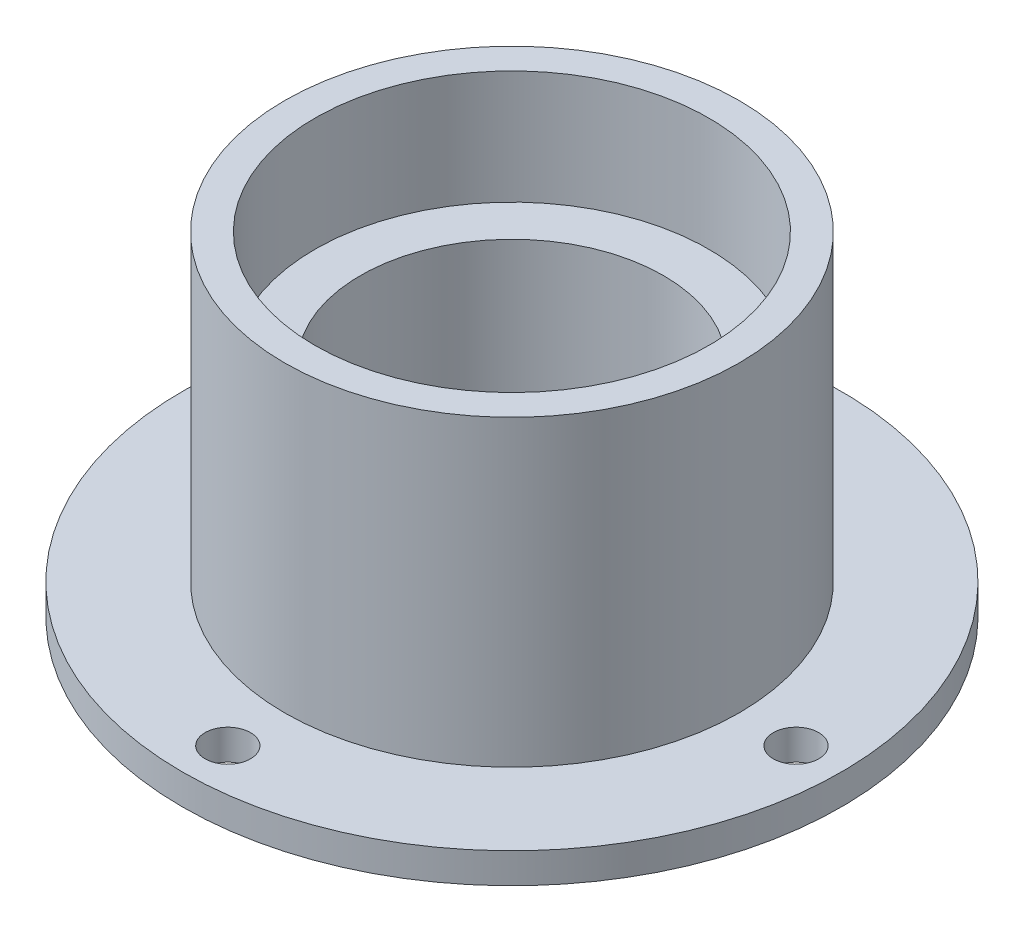
ISO-10303-21;
HEADER;
FILE_DESCRIPTION(('STEP AP214'),'2;1');
FILE_NAME('part.step','',(''),(''),'','','');
FILE_SCHEMA(('AUTOMOTIVE_DESIGN { 1 0 10303 214 1 1 1 1 }'));
ENDSEC;
DATA;
#1=APPLICATION_CONTEXT('core data for automotive mechanical design processes');
#2=APPLICATION_PROTOCOL_DEFINITION('international standard','automotive_design',2000,#1);
#3=PRODUCT_CONTEXT('',#1,'mechanical');
#4=PRODUCT('Part','Part','',(#3));
#5=PRODUCT_RELATED_PRODUCT_CATEGORY('part','',(#4));
#6=PRODUCT_DEFINITION_FORMATION('','',#4);
#7=PRODUCT_DEFINITION_CONTEXT('part definition',#1,'design');
#8=PRODUCT_DEFINITION('design','',#6,#7);
#9=PRODUCT_DEFINITION_SHAPE('','',#8);
#10=(LENGTH_UNIT() NAMED_UNIT(*) SI_UNIT(.MILLI.,.METRE.));
#11=(NAMED_UNIT(*) PLANE_ANGLE_UNIT() SI_UNIT($,.RADIAN.));
#12=(NAMED_UNIT(*) SI_UNIT($,.STERADIAN.) SOLID_ANGLE_UNIT());
#13=UNCERTAINTY_MEASURE_WITH_UNIT(LENGTH_MEASURE(1.E-05),#10,'distance_accuracy_value','');
#14=(GEOMETRIC_REPRESENTATION_CONTEXT(3) GLOBAL_UNCERTAINTY_ASSIGNED_CONTEXT((#13)) GLOBAL_UNIT_ASSIGNED_CONTEXT((#10,
#11,#12)) REPRESENTATION_CONTEXT('',''));
#15=CARTESIAN_POINT('',(0.,0.,0.));
#16=DIRECTION('',(0.,0.,1.));
#17=DIRECTION('',(1.,0.,0.));
#18=AXIS2_PLACEMENT_3D('',#15,#16,#17);
#19=CARTESIAN_POINT('',(0.,44.,0.));
#20=DIRECTION('',(0.,-1.,0.));
#21=DIRECTION('',(0.,0.,-1.));
#22=AXIS2_PLACEMENT_3D('',#19,#20,#21);
#23=CYLINDRICAL_SURFACE('',#22,20.);
#24=CARTESIAN_POINT('',(0.,2.,0.));
#25=DIRECTION('',(0.,1.,0.));
#26=DIRECTION('',(0.,0.,1.));
#27=AXIS2_PLACEMENT_3D('',#24,#25,#26);
#28=CIRCLE('',#27,20.);
#29=CARTESIAN_POINT('',(0.,2.,20.));
#30=VERTEX_POINT('',#29);
#31=EDGE_CURVE('E66',#30,#30,#28,.T.);
#32=ORIENTED_EDGE('',*,*,#31,.F.);
#33=EDGE_LOOP('',(#32));
#34=FACE_BOUND('',#33,.T.);
#35=CARTESIAN_POINT('',(0.,29.,0.));
#36=DIRECTION('',(0.,1.,0.));
#37=DIRECTION('',(0.,0.,1.));
#38=AXIS2_PLACEMENT_3D('',#35,#36,#37);
#39=CIRCLE('',#38,20.);
#40=CARTESIAN_POINT('',(0.,29.,20.));
#41=VERTEX_POINT('',#40);
#42=EDGE_CURVE('E41',#41,#41,#39,.T.);
#43=ORIENTED_EDGE('',*,*,#42,.T.);
#44=EDGE_LOOP('',(#43));
#45=FACE_BOUND('',#44,.T.);
#46=ADVANCED_FACE('F37',(#34,#45),#23,.F.);
#47=CARTESIAN_POINT('',(0.,0.,0.));
#48=DIRECTION('',(0.,1.,0.));
#49=DIRECTION('',(0.,0.,1.));
#50=AXIS2_PLACEMENT_3D('',#47,#48,#49);
#51=PLANE('',#50);
#52=CARTESIAN_POINT('',(0.,0.,37.5));
#53=DIRECTION('',(0.,1.,0.));
#54=DIRECTION('',(0.,0.,1.));
#55=AXIS2_PLACEMENT_3D('',#52,#53,#54);
#56=CIRCLE('',#55,3.);
#57=CARTESIAN_POINT('',(0.,0.,40.5));
#58=VERTEX_POINT('',#57);
#59=EDGE_CURVE('E103',#58,#58,#56,.T.);
#60=ORIENTED_EDGE('',*,*,#59,.T.);
#61=EDGE_LOOP('',(#60));
#62=FACE_BOUND('',#61,.T.);
#63=CARTESIAN_POINT('',(37.5,0.,3.92791650619853E-13));
#64=DIRECTION('',(0.,1.,0.));
#65=DIRECTION('',(0.,0.,1.));
#66=AXIS2_PLACEMENT_3D('',#63,#64,#65);
#67=CIRCLE('',#66,3.);
#68=CARTESIAN_POINT('',(37.5,0.,3.00000000000039));
#69=VERTEX_POINT('',#68);
#70=EDGE_CURVE('E95',#69,#69,#67,.T.);
#71=ORIENTED_EDGE('',*,*,#70,.T.);
#72=EDGE_LOOP('',(#71));
#73=FACE_BOUND('',#72,.T.);
#74=CARTESIAN_POINT('',(2.61861100413235E-13,0.,-37.5));
#75=DIRECTION('',(0.,1.,0.));
#76=DIRECTION('',(0.,0.,1.));
#77=AXIS2_PLACEMENT_3D('',#74,#75,#76);
#78=CIRCLE('',#77,3.);
#79=CARTESIAN_POINT('',(2.61861100413235E-13,0.,-34.5));
#80=VERTEX_POINT('',#79);
#81=EDGE_CURVE('E86',#80,#80,#78,.T.);
#82=ORIENTED_EDGE('',*,*,#81,.T.);
#83=EDGE_LOOP('',(#82));
#84=FACE_BOUND('',#83,.T.);
#85=CARTESIAN_POINT('',(-37.5,0.,-1.30930550206618E-13));
#86=DIRECTION('',(0.,1.,0.));
#87=DIRECTION('',(0.,0.,1.));
#88=AXIS2_PLACEMENT_3D('',#85,#86,#87);
#89=CIRCLE('',#88,3.);
#90=CARTESIAN_POINT('',(-37.5,0.,2.99999999999987));
#91=VERTEX_POINT('',#90);
#92=EDGE_CURVE('E87',#91,#91,#89,.T.);
#93=ORIENTED_EDGE('',*,*,#92,.T.);
#94=EDGE_LOOP('',(#93));
#95=FACE_BOUND('',#94,.T.);
#96=CARTESIAN_POINT('',(0.,0.,0.));
#97=DIRECTION('',(0.,1.,0.));
#98=DIRECTION('',(0.,0.,1.));
#99=AXIS2_PLACEMENT_3D('',#96,#97,#98);
#100=CIRCLE('',#99,43.5);
#101=CARTESIAN_POINT('',(0.,0.,43.5));
#102=VERTEX_POINT('',#101);
#103=EDGE_CURVE('E46',#102,#102,#100,.T.);
#104=ORIENTED_EDGE('',*,*,#103,.F.);
#105=EDGE_LOOP('',(#104));
#106=FACE_BOUND('',#105,.T.);
#107=CARTESIAN_POINT('',(0.,0.,0.));
#108=DIRECTION('',(0.,1.,0.));
#109=DIRECTION('',(0.,0.,1.));
#110=AXIS2_PLACEMENT_3D('',#107,#108,#109);
#111=CIRCLE('',#110,30.);
#112=CARTESIAN_POINT('',(0.,0.,30.));
#113=VERTEX_POINT('',#112);
#114=EDGE_CURVE('E62',#113,#113,#111,.T.);
#115=ORIENTED_EDGE('',*,*,#114,.T.);
#116=EDGE_LOOP('',(#115));
#117=FACE_BOUND('',#116,.T.);
#118=ADVANCED_FACE('F114',(#62,#73,#84,#95,#106,#117),#51,.F.);
#119=CARTESIAN_POINT('',(0.,4.,0.));
#120=DIRECTION('',(0.,1.,0.));
#121=DIRECTION('',(0.,0.,1.));
#122=AXIS2_PLACEMENT_3D('',#119,#120,#121);
#123=PLANE('',#122);
#124=CARTESIAN_POINT('',(0.,4.,37.5));
#125=DIRECTION('',(0.,1.,0.));
#126=DIRECTION('',(0.,0.,1.));
#127=AXIS2_PLACEMENT_3D('',#124,#125,#126);
#128=CIRCLE('',#127,3.);
#129=CARTESIAN_POINT('',(0.,4.,40.5));
#130=VERTEX_POINT('',#129);
#131=EDGE_CURVE('E78',#130,#130,#128,.T.);
#132=ORIENTED_EDGE('',*,*,#131,.F.);
#133=EDGE_LOOP('',(#132));
#134=FACE_BOUND('',#133,.T.);
#135=CARTESIAN_POINT('',(37.5,4.,3.92791650619853E-13));
#136=DIRECTION('',(0.,1.,0.));
#137=DIRECTION('',(0.,0.,1.));
#138=AXIS2_PLACEMENT_3D('',#135,#136,#137);
#139=CIRCLE('',#138,3.);
#140=CARTESIAN_POINT('',(37.5,4.,3.00000000000039));
#141=VERTEX_POINT('',#140);
#142=EDGE_CURVE('E99',#141,#141,#139,.T.);
#143=ORIENTED_EDGE('',*,*,#142,.F.);
#144=EDGE_LOOP('',(#143));
#145=FACE_BOUND('',#144,.T.);
#146=CARTESIAN_POINT('',(2.61861100413235E-13,4.,-37.5));
#147=DIRECTION('',(0.,1.,0.));
#148=DIRECTION('',(0.,0.,1.));
#149=AXIS2_PLACEMENT_3D('',#146,#147,#148);
#150=CIRCLE('',#149,3.);
#151=CARTESIAN_POINT('',(2.61861100413235E-13,4.,-34.5));
#152=VERTEX_POINT('',#151);
#153=EDGE_CURVE('E91',#152,#152,#150,.T.);
#154=ORIENTED_EDGE('',*,*,#153,.F.);
#155=EDGE_LOOP('',(#154));
#156=FACE_BOUND('',#155,.T.);
#157=CARTESIAN_POINT('',(-37.5,4.,-1.30930550206618E-13));
#158=DIRECTION('',(0.,1.,0.));
#159=DIRECTION('',(0.,0.,1.));
#160=AXIS2_PLACEMENT_3D('',#157,#158,#159);
#161=CIRCLE('',#160,3.);
#162=CARTESIAN_POINT('',(-37.5,4.,2.99999999999987));
#163=VERTEX_POINT('',#162);
#164=EDGE_CURVE('E82',#163,#163,#161,.T.);
#165=ORIENTED_EDGE('',*,*,#164,.F.);
#166=EDGE_LOOP('',(#165));
#167=FACE_BOUND('',#166,.T.);
#168=CARTESIAN_POINT('',(0.,4.,0.));
#169=DIRECTION('',(0.,1.,0.));
#170=DIRECTION('',(0.,0.,1.));
#171=AXIS2_PLACEMENT_3D('',#168,#169,#170);
#172=CIRCLE('',#171,43.5);
#173=CARTESIAN_POINT('',(0.,4.,43.5));
#174=VERTEX_POINT('',#173);
#175=EDGE_CURVE('E10',#174,#174,#172,.T.);
#176=ORIENTED_EDGE('',*,*,#175,.T.);
#177=EDGE_LOOP('',(#176));
#178=FACE_BOUND('',#177,.T.);
#179=CARTESIAN_POINT('',(0.,4.,0.));
#180=DIRECTION('',(0.,1.,0.));
#181=DIRECTION('',(0.,0.,1.));
#182=AXIS2_PLACEMENT_3D('',#179,#180,#181);
#183=CIRCLE('',#182,30.);
#184=CARTESIAN_POINT('',(0.,4.,30.));
#185=VERTEX_POINT('',#184);
#186=EDGE_CURVE('E52',#185,#185,#183,.T.);
#187=ORIENTED_EDGE('',*,*,#186,.F.);
#188=EDGE_LOOP('',(#187));
#189=FACE_BOUND('',#188,.T.);
#190=ADVANCED_FACE('F124',(#134,#145,#156,#167,#178,#189),#123,.T.);
#191=CARTESIAN_POINT('',(0.,4.,0.));
#192=DIRECTION('',(0.,-1.,0.));
#193=DIRECTION('',(0.,0.,-1.));
#194=AXIS2_PLACEMENT_3D('',#191,#192,#193);
#195=CYLINDRICAL_SURFACE('',#194,43.5);
#196=ORIENTED_EDGE('',*,*,#175,.F.);
#197=EDGE_LOOP('',(#196));
#198=FACE_BOUND('',#197,.T.);
#199=ORIENTED_EDGE('',*,*,#103,.T.);
#200=EDGE_LOOP('',(#199));
#201=FACE_BOUND('',#200,.T.);
#202=ADVANCED_FACE('F39',(#198,#201),#195,.T.);
#203=CARTESIAN_POINT('',(0.,44.,0.));
#204=DIRECTION('',(0.,1.,0.));
#205=DIRECTION('',(0.,0.,1.));
#206=AXIS2_PLACEMENT_3D('',#203,#204,#205);
#207=PLANE('',#206);
#208=CARTESIAN_POINT('',(0.,44.,0.));
#209=DIRECTION('',(0.,1.,0.));
#210=DIRECTION('',(0.,0.,1.));
#211=AXIS2_PLACEMENT_3D('',#208,#209,#210);
#212=CIRCLE('',#211,26.);
#213=CARTESIAN_POINT('',(0.,44.,26.));
#214=VERTEX_POINT('',#213);
#215=EDGE_CURVE('E73',#214,#214,#212,.T.);
#216=ORIENTED_EDGE('',*,*,#215,.F.);
#217=EDGE_LOOP('',(#216));
#218=FACE_BOUND('',#217,.T.);
#219=CARTESIAN_POINT('',(0.,44.,0.));
#220=DIRECTION('',(0.,1.,0.));
#221=DIRECTION('',(0.,0.,1.));
#222=AXIS2_PLACEMENT_3D('',#219,#220,#221);
#223=CIRCLE('',#222,30.);
#224=CARTESIAN_POINT('',(0.,44.,30.));
#225=VERTEX_POINT('',#224);
#226=EDGE_CURVE('E57',#225,#225,#223,.T.);
#227=ORIENTED_EDGE('',*,*,#226,.T.);
#228=EDGE_LOOP('',(#227));
#229=FACE_BOUND('',#228,.T.);
#230=ADVANCED_FACE('F140',(#218,#229),#207,.T.);
#231=CARTESIAN_POINT('',(0.,44.,0.));
#232=DIRECTION('',(0.,-1.,0.));
#233=DIRECTION('',(0.,0.,-1.));
#234=AXIS2_PLACEMENT_3D('',#231,#232,#233);
#235=CYLINDRICAL_SURFACE('',#234,30.);
#236=ORIENTED_EDGE('',*,*,#186,.T.);
#237=EDGE_LOOP('',(#236));
#238=FACE_BOUND('',#237,.T.);
#239=ORIENTED_EDGE('',*,*,#226,.F.);
#240=EDGE_LOOP('',(#239));
#241=FACE_BOUND('',#240,.T.);
#242=ADVANCED_FACE('F136',(#238,#241),#235,.T.);
#243=CARTESIAN_POINT('',(0.,2.,0.));
#244=DIRECTION('',(0.,1.,0.));
#245=DIRECTION('',(0.,0.,1.));
#246=AXIS2_PLACEMENT_3D('',#243,#244,#245);
#247=PLANE('',#246);
#248=CARTESIAN_POINT('',(0.,2.,0.));
#249=DIRECTION('',(0.,1.,0.));
#250=DIRECTION('',(0.,0.,1.));
#251=AXIS2_PLACEMENT_3D('',#248,#249,#250);
#252=CIRCLE('',#251,30.);
#253=CARTESIAN_POINT('',(0.,2.,30.));
#254=VERTEX_POINT('',#253);
#255=EDGE_CURVE('E61',#254,#254,#252,.T.);
#256=ORIENTED_EDGE('',*,*,#255,.F.);
#257=EDGE_LOOP('',(#256));
#258=FACE_BOUND('',#257,.T.);
#259=ORIENTED_EDGE('',*,*,#31,.T.);
#260=EDGE_LOOP('',(#259));
#261=FACE_BOUND('',#260,.T.);
#262=ADVANCED_FACE('F139',(#258,#261),#247,.F.);
#263=CARTESIAN_POINT('',(0.,2.,0.));
#264=DIRECTION('',(0.,-1.,0.));
#265=DIRECTION('',(0.,0.,-1.));
#266=AXIS2_PLACEMENT_3D('',#263,#264,#265);
#267=CYLINDRICAL_SURFACE('',#266,30.);
#268=ORIENTED_EDGE('',*,*,#255,.T.);
#269=EDGE_LOOP('',(#268));
#270=FACE_BOUND('',#269,.T.);
#271=ORIENTED_EDGE('',*,*,#114,.F.);
#272=EDGE_LOOP('',(#271));
#273=FACE_BOUND('',#272,.T.);
#274=ADVANCED_FACE('F161',(#270,#273),#267,.F.);
#275=CARTESIAN_POINT('',(0.,29.,0.));
#276=DIRECTION('',(0.,1.,0.));
#277=DIRECTION('',(0.,0.,1.));
#278=AXIS2_PLACEMENT_3D('',#275,#276,#277);
#279=CYLINDRICAL_SURFACE('',#278,26.);
#280=CARTESIAN_POINT('',(0.,29.,0.));
#281=DIRECTION('',(0.,1.,0.));
#282=DIRECTION('',(0.,0.,1.));
#283=AXIS2_PLACEMENT_3D('',#280,#281,#282);
#284=CIRCLE('',#283,26.);
#285=CARTESIAN_POINT('',(0.,29.,26.));
#286=VERTEX_POINT('',#285);
#287=EDGE_CURVE('E77',#286,#286,#284,.T.);
#288=ORIENTED_EDGE('',*,*,#287,.F.);
#289=EDGE_LOOP('',(#288));
#290=FACE_BOUND('',#289,.T.);
#291=ORIENTED_EDGE('',*,*,#215,.T.);
#292=EDGE_LOOP('',(#291));
#293=FACE_BOUND('',#292,.T.);
#294=ADVANCED_FACE('F164',(#290,#293),#279,.F.);
#295=CARTESIAN_POINT('',(0.,29.,0.));
#296=DIRECTION('',(0.,1.,0.));
#297=DIRECTION('',(0.,0.,1.));
#298=AXIS2_PLACEMENT_3D('',#295,#296,#297);
#299=PLANE('',#298);
#300=ORIENTED_EDGE('',*,*,#42,.F.);
#301=EDGE_LOOP('',(#300));
#302=FACE_BOUND('',#301,.T.);
#303=ORIENTED_EDGE('',*,*,#287,.T.);
#304=EDGE_LOOP('',(#303));
#305=FACE_BOUND('',#304,.T.);
#306=ADVANCED_FACE('F171',(#302,#305),#299,.T.);
#307=CARTESIAN_POINT('',(-37.5,12.4852813742386,-1.30930550206618E-13));
#308=DIRECTION('',(0.,-1.,0.));
#309=DIRECTION('',(0.,0.,-1.));
#310=AXIS2_PLACEMENT_3D('',#307,#308,#309);
#311=CYLINDRICAL_SURFACE('',#310,3.);
#312=ORIENTED_EDGE('',*,*,#92,.F.);
#313=EDGE_LOOP('',(#312));
#314=FACE_BOUND('',#313,.T.);
#315=ORIENTED_EDGE('',*,*,#164,.T.);
#316=EDGE_LOOP('',(#315));
#317=FACE_BOUND('',#316,.T.);
#318=ADVANCED_FACE('F175',(#314,#317),#311,.F.);
#319=CARTESIAN_POINT('',(2.61861100413235E-13,12.4852813742386,-37.5));
#320=DIRECTION('',(0.,-1.,0.));
#321=DIRECTION('',(0.,0.,-1.));
#322=AXIS2_PLACEMENT_3D('',#319,#320,#321);
#323=CYLINDRICAL_SURFACE('',#322,3.);
#324=ORIENTED_EDGE('',*,*,#81,.F.);
#325=EDGE_LOOP('',(#324));
#326=FACE_BOUND('',#325,.T.);
#327=ORIENTED_EDGE('',*,*,#153,.T.);
#328=EDGE_LOOP('',(#327));
#329=FACE_BOUND('',#328,.T.);
#330=ADVANCED_FACE('F179',(#326,#329),#323,.F.);
#331=CARTESIAN_POINT('',(37.5,12.4852813742386,3.92791650619853E-13));
#332=DIRECTION('',(0.,-1.,0.));
#333=DIRECTION('',(0.,0.,-1.));
#334=AXIS2_PLACEMENT_3D('',#331,#332,#333);
#335=CYLINDRICAL_SURFACE('',#334,3.);
#336=ORIENTED_EDGE('',*,*,#70,.F.);
#337=EDGE_LOOP('',(#336));
#338=FACE_BOUND('',#337,.T.);
#339=ORIENTED_EDGE('',*,*,#142,.T.);
#340=EDGE_LOOP('',(#339));
#341=FACE_BOUND('',#340,.T.);
#342=ADVANCED_FACE('F120',(#338,#341),#335,.F.);
#343=CARTESIAN_POINT('',(0.,12.4852813742386,37.5));
#344=DIRECTION('',(0.,-1.,0.));
#345=DIRECTION('',(0.,0.,-1.));
#346=AXIS2_PLACEMENT_3D('',#343,#344,#345);
#347=CYLINDRICAL_SURFACE('',#346,3.);
#348=ORIENTED_EDGE('',*,*,#59,.F.);
#349=EDGE_LOOP('',(#348));
#350=FACE_BOUND('',#349,.T.);
#351=ORIENTED_EDGE('',*,*,#131,.T.);
#352=EDGE_LOOP('',(#351));
#353=FACE_BOUND('',#352,.T.);
#354=ADVANCED_FACE('F117',(#350,#353),#347,.F.);
#355=CLOSED_SHELL('',(#46,#118,#190,#202,#230,#242,#262,#274,#294,#306,#318,#330,#342,#354));
#356=MANIFOLD_SOLID_BREP('B2',#355);
#357=ADVANCED_BREP_SHAPE_REPRESENTATION('',(#18,#356),#14);
#358=SHAPE_DEFINITION_REPRESENTATION(#9,#357);
ENDSEC;
END-ISO-10303-21;
